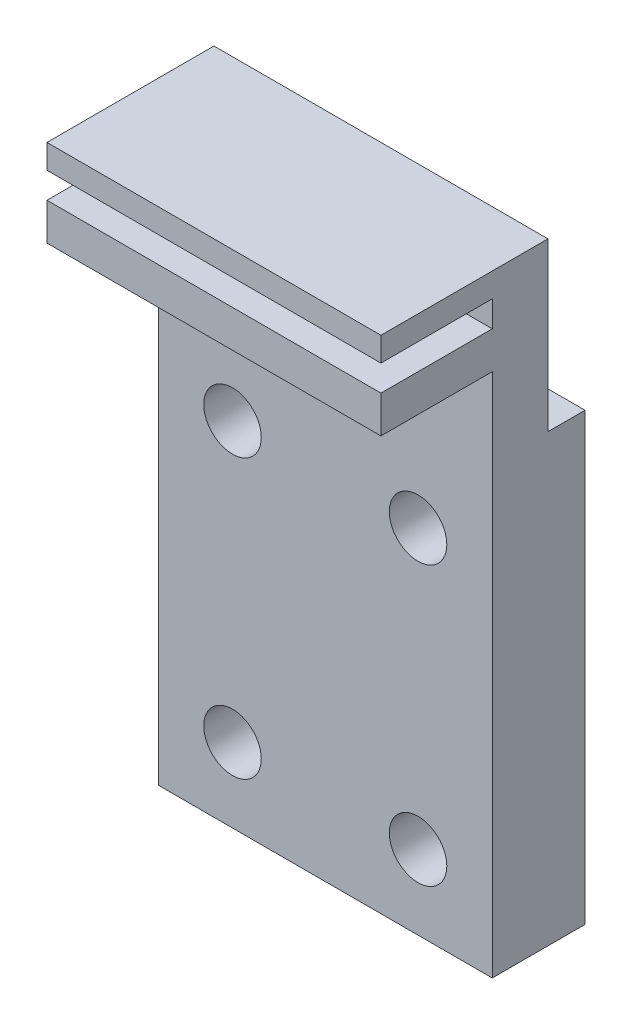
ISO-10303-21;
HEADER;
FILE_DESCRIPTION(('STEP AP214'),'2;1');
FILE_NAME('part.step','',(''),(''),'','','');
FILE_SCHEMA(('AUTOMOTIVE_DESIGN { 1 0 10303 214 1 1 1 1 }'));
ENDSEC;
DATA;
#1=APPLICATION_CONTEXT('core data for automotive mechanical design processes');
#2=APPLICATION_PROTOCOL_DEFINITION('international standard','automotive_design',2000,#1);
#3=PRODUCT_CONTEXT('',#1,'mechanical');
#4=PRODUCT('Part','Part','',(#3));
#5=PRODUCT_RELATED_PRODUCT_CATEGORY('part','',(#4));
#6=PRODUCT_DEFINITION_FORMATION('','',#4);
#7=PRODUCT_DEFINITION_CONTEXT('part definition',#1,'design');
#8=PRODUCT_DEFINITION('design','',#6,#7);
#9=PRODUCT_DEFINITION_SHAPE('','',#8);
#10=(LENGTH_UNIT() NAMED_UNIT(*) SI_UNIT(.MILLI.,.METRE.));
#11=(NAMED_UNIT(*) PLANE_ANGLE_UNIT() SI_UNIT($,.RADIAN.));
#12=(NAMED_UNIT(*) SI_UNIT($,.STERADIAN.) SOLID_ANGLE_UNIT());
#13=UNCERTAINTY_MEASURE_WITH_UNIT(LENGTH_MEASURE(1.E-05),#10,'distance_accuracy_value','');
#14=(GEOMETRIC_REPRESENTATION_CONTEXT(3) GLOBAL_UNCERTAINTY_ASSIGNED_CONTEXT((#13)) GLOBAL_UNIT_ASSIGNED_CONTEXT((#10,
#11,#12)) REPRESENTATION_CONTEXT('',''));
#15=CARTESIAN_POINT('',(0.,0.,0.));
#16=DIRECTION('',(0.,0.,1.));
#17=DIRECTION('',(1.,0.,0.));
#18=AXIS2_PLACEMENT_3D('',#15,#16,#17);
#19=CARTESIAN_POINT('',(0.,0.,0.));
#20=DIRECTION('',(0.,0.,1.));
#21=DIRECTION('',(1.,0.,0.));
#22=AXIS2_PLACEMENT_3D('',#19,#20,#21);
#23=PLANE('',#22);
#24=CARTESIAN_POINT('',(-5.,-7.5,0.));
#25=DIRECTION('',(0.,0.,1.));
#26=DIRECTION('',(1.,0.,0.));
#27=AXIS2_PLACEMENT_3D('',#24,#25,#26);
#28=CIRCLE('',#27,1.55);
#29=CARTESIAN_POINT('',(-3.45,-7.5,0.));
#30=VERTEX_POINT('',#29);
#31=EDGE_CURVE('E203',#30,#30,#28,.T.);
#32=ORIENTED_EDGE('',*,*,#31,.F.);
#33=EDGE_LOOP('',(#32));
#34=FACE_BOUND('',#33,.T.);
#35=CARTESIAN_POINT('',(5.,-7.5,0.));
#36=DIRECTION('',(0.,0.,1.));
#37=DIRECTION('',(1.,0.,0.));
#38=AXIS2_PLACEMENT_3D('',#35,#36,#37);
#39=CIRCLE('',#38,1.55);
#40=CARTESIAN_POINT('',(6.55,-7.5,0.));
#41=VERTEX_POINT('',#40);
#42=EDGE_CURVE('E206',#41,#41,#39,.T.);
#43=ORIENTED_EDGE('',*,*,#42,.F.);
#44=EDGE_LOOP('',(#43));
#45=FACE_BOUND('',#44,.T.);
#46=CARTESIAN_POINT('',(5.,7.5,0.));
#47=DIRECTION('',(0.,0.,1.));
#48=DIRECTION('',(1.,0.,0.));
#49=AXIS2_PLACEMENT_3D('',#46,#47,#48);
#50=CIRCLE('',#49,1.55);
#51=CARTESIAN_POINT('',(6.55,7.5,0.));
#52=VERTEX_POINT('',#51);
#53=EDGE_CURVE('E209',#52,#52,#50,.T.);
#54=ORIENTED_EDGE('',*,*,#53,.F.);
#55=EDGE_LOOP('',(#54));
#56=FACE_BOUND('',#55,.T.);
#57=CARTESIAN_POINT('',(-5.,7.5,0.));
#58=DIRECTION('',(0.,0.,1.));
#59=DIRECTION('',(1.,0.,0.));
#60=AXIS2_PLACEMENT_3D('',#57,#58,#59);
#61=CIRCLE('',#60,1.55);
#62=CARTESIAN_POINT('',(-3.45,7.5,0.));
#63=VERTEX_POINT('',#62);
#64=EDGE_CURVE('E176',#63,#63,#61,.T.);
#65=ORIENTED_EDGE('',*,*,#64,.F.);
#66=EDGE_LOOP('',(#65));
#67=FACE_BOUND('',#66,.T.);
#68=DIRECTION('',(0.,1.,0.));
#69=VECTOR('',#68,1.);
#70=CARTESIAN_POINT('',(9.,0.,0.));
#71=LINE('',#70,#69);
#72=CARTESIAN_POINT('',(9.,-11.5,0.));
#73=VERTEX_POINT('',#72);
#74=CARTESIAN_POINT('',(9.,16.8,0.));
#75=VERTEX_POINT('',#74);
#76=EDGE_CURVE('E201',#73,#75,#71,.T.);
#77=ORIENTED_EDGE('',*,*,#76,.T.);
#78=DIRECTION('',(1.,0.,0.));
#79=VECTOR('',#78,1.);
#80=CARTESIAN_POINT('',(0.,16.8,0.));
#81=LINE('',#80,#79);
#82=CARTESIAN_POINT('',(-9.,16.8,0.));
#83=VERTEX_POINT('',#82);
#84=EDGE_CURVE('E224',#83,#75,#81,.T.);
#85=ORIENTED_EDGE('',*,*,#84,.F.);
#86=DIRECTION('',(0.,1.,0.));
#87=VECTOR('',#86,1.);
#88=CARTESIAN_POINT('',(-9.,0.,0.));
#89=LINE('',#88,#87);
#90=CARTESIAN_POINT('',(-9.,-11.5,0.));
#91=VERTEX_POINT('',#90);
#92=EDGE_CURVE('E194',#91,#83,#89,.T.);
#93=ORIENTED_EDGE('',*,*,#92,.F.);
#94=DIRECTION('',(1.,0.,0.));
#95=VECTOR('',#94,1.);
#96=CARTESIAN_POINT('',(0.,-11.5,0.));
#97=LINE('',#96,#95);
#98=EDGE_CURVE('E197',#91,#73,#97,.T.);
#99=ORIENTED_EDGE('',*,*,#98,.T.);
#100=EDGE_LOOP('',(#77,#85,#93,#99));
#101=FACE_BOUND('',#100,.T.);
#102=ADVANCED_FACE('F37',(#34,#45,#56,#67,#101),#23,.T.);
#103=CARTESIAN_POINT('',(-9.,0.,-5.));
#104=DIRECTION('',(1.,0.,0.));
#105=DIRECTION('',(0.,1.,0.));
#106=AXIS2_PLACEMENT_3D('',#103,#104,#105);
#107=PLANE('',#106);
#108=DIRECTION('',(0.,-1.,0.));
#109=VECTOR('',#108,1.);
#110=CARTESIAN_POINT('',(-9.,21.5,-3.));
#111=LINE('',#110,#109);
#112=CARTESIAN_POINT('',(-9.,21.5,-3.));
#113=VERTEX_POINT('',#112);
#114=CARTESIAN_POINT('',(-9.00000000000001,12.5,-3.));
#115=VERTEX_POINT('',#114);
#116=EDGE_CURVE('E126',#113,#115,#111,.T.);
#117=ORIENTED_EDGE('',*,*,#116,.T.);
#118=DIRECTION('',(0.,0.,-1.));
#119=VECTOR('',#118,1.);
#120=CARTESIAN_POINT('',(-9.00000000000001,12.5,-5.));
#121=LINE('',#120,#119);
#122=CARTESIAN_POINT('',(-9.00000000000001,12.5,-5.));
#123=VERTEX_POINT('',#122);
#124=EDGE_CURVE('E137',#115,#123,#121,.T.);
#125=ORIENTED_EDGE('',*,*,#124,.T.);
#126=DIRECTION('',(0.,1.,0.));
#127=VECTOR('',#126,1.);
#128=CARTESIAN_POINT('',(-9.,0.,-5.));
#129=LINE('',#128,#127);
#130=CARTESIAN_POINT('',(-9.,-11.5,-5.));
#131=VERTEX_POINT('',#130);
#132=EDGE_CURVE('E172',#131,#123,#129,.T.);
#133=ORIENTED_EDGE('',*,*,#132,.F.);
#134=DIRECTION('',(0.,0.,1.));
#135=VECTOR('',#134,1.);
#136=CARTESIAN_POINT('',(-9.,-11.5,-5.));
#137=LINE('',#136,#135);
#138=EDGE_CURVE('E41',#131,#91,#137,.T.);
#139=ORIENTED_EDGE('',*,*,#138,.T.);
#140=ORIENTED_EDGE('',*,*,#92,.T.);
#141=DIRECTION('',(0.,0.,-1.));
#142=VECTOR('',#141,1.);
#143=CARTESIAN_POINT('',(-9.,16.8,6.));
#144=LINE('',#143,#142);
#145=CARTESIAN_POINT('',(-9.,16.8,6.));
#146=VERTEX_POINT('',#145);
#147=EDGE_CURVE('E168',#146,#83,#144,.T.);
#148=ORIENTED_EDGE('',*,*,#147,.F.);
#149=DIRECTION('',(0.,1.,0.));
#150=VECTOR('',#149,1.);
#151=CARTESIAN_POINT('',(-9.,0.,6.));
#152=LINE('',#151,#150);
#153=CARTESIAN_POINT('',(-9.,18.8,6.));
#154=VERTEX_POINT('',#153);
#155=EDGE_CURVE('E454',#146,#154,#152,.T.);
#156=ORIENTED_EDGE('',*,*,#155,.T.);
#157=DIRECTION('',(0.,0.,-1.));
#158=VECTOR('',#157,1.);
#159=CARTESIAN_POINT('',(-9.,18.8,6.));
#160=LINE('',#159,#158);
#161=CARTESIAN_POINT('',(-9.,18.8,0.));
#162=VERTEX_POINT('',#161);
#163=EDGE_CURVE('E464',#154,#162,#160,.T.);
#164=ORIENTED_EDGE('',*,*,#163,.T.);
#165=CARTESIAN_POINT('',(-9.,20.2,0.));
#166=VERTEX_POINT('',#165);
#167=EDGE_CURVE('E171',#162,#166,#89,.T.);
#168=ORIENTED_EDGE('',*,*,#167,.T.);
#169=DIRECTION('',(0.,0.,-1.));
#170=VECTOR('',#169,1.);
#171=CARTESIAN_POINT('',(-9.,20.2,6.));
#172=LINE('',#171,#170);
#173=CARTESIAN_POINT('',(-9.,20.2,6.));
#174=VERTEX_POINT('',#173);
#175=EDGE_CURVE('E149',#174,#166,#172,.T.);
#176=ORIENTED_EDGE('',*,*,#175,.F.);
#177=DIRECTION('',(0.,1.,0.));
#178=VECTOR('',#177,1.);
#179=CARTESIAN_POINT('',(-9.,0.,6.));
#180=LINE('',#179,#178);
#181=CARTESIAN_POINT('',(-9.,21.5,6.));
#182=VERTEX_POINT('',#181);
#183=EDGE_CURVE('E146',#174,#182,#180,.T.);
#184=ORIENTED_EDGE('',*,*,#183,.T.);
#185=DIRECTION('',(0.,0.,1.));
#186=VECTOR('',#185,1.);
#187=CARTESIAN_POINT('',(-9.,21.5,-5.));
#188=LINE('',#187,#186);
#189=EDGE_CURVE('E11',#113,#182,#188,.T.);
#190=ORIENTED_EDGE('',*,*,#189,.F.);
#191=EDGE_LOOP('',(#117,#125,#133,#139,#140,#148,#156,#164,#168,#176,#184,#190));
#192=FACE_BOUND('',#191,.T.);
#193=ADVANCED_FACE('F39',(#192),#107,.F.);
#194=CARTESIAN_POINT('',(0.,21.5,-5.));
#195=DIRECTION('',(0.,-1.,0.));
#196=DIRECTION('',(0.,0.,-1.));
#197=AXIS2_PLACEMENT_3D('',#194,#195,#196);
#198=PLANE('',#197);
#199=DIRECTION('',(0.,0.,1.));
#200=VECTOR('',#199,1.);
#201=CARTESIAN_POINT('',(9.,21.5,-5.));
#202=LINE('',#201,#200);
#203=CARTESIAN_POINT('',(9.,21.5,-3.));
#204=VERTEX_POINT('',#203);
#205=CARTESIAN_POINT('',(9.,21.5,6.));
#206=VERTEX_POINT('',#205);
#207=EDGE_CURVE('E46',#204,#206,#202,.T.);
#208=ORIENTED_EDGE('',*,*,#207,.F.);
#209=DIRECTION('',(1.,0.,0.));
#210=VECTOR('',#209,1.);
#211=CARTESIAN_POINT('',(-9.,21.5,-3.));
#212=LINE('',#211,#210);
#213=EDGE_CURVE('E130',#113,#204,#212,.T.);
#214=ORIENTED_EDGE('',*,*,#213,.F.);
#215=ORIENTED_EDGE('',*,*,#189,.T.);
#216=DIRECTION('',(1.,0.,0.));
#217=VECTOR('',#216,1.);
#218=CARTESIAN_POINT('',(0.,21.5,6.));
#219=LINE('',#218,#217);
#220=EDGE_CURVE('E156',#182,#206,#219,.T.);
#221=ORIENTED_EDGE('',*,*,#220,.T.);
#222=EDGE_LOOP('',(#208,#214,#215,#221));
#223=FACE_BOUND('',#222,.T.);
#224=ADVANCED_FACE('F141',(#223),#198,.F.);
#225=CARTESIAN_POINT('',(9.,0.,-5.));
#226=DIRECTION('',(1.,0.,0.));
#227=DIRECTION('',(0.,1.,0.));
#228=AXIS2_PLACEMENT_3D('',#225,#226,#227);
#229=PLANE('',#228);
#230=DIRECTION('',(0.,0.,-1.));
#231=VECTOR('',#230,1.);
#232=CARTESIAN_POINT('',(9.,12.5,-5.));
#233=LINE('',#232,#231);
#234=CARTESIAN_POINT('',(9.,12.5,-3.));
#235=VERTEX_POINT('',#234);
#236=CARTESIAN_POINT('',(9.,12.5,-5.));
#237=VERTEX_POINT('',#236);
#238=EDGE_CURVE('E54',#235,#237,#233,.T.);
#239=ORIENTED_EDGE('',*,*,#238,.F.);
#240=DIRECTION('',(0.,-1.,0.));
#241=VECTOR('',#240,1.);
#242=CARTESIAN_POINT('',(9.,21.5,-3.));
#243=LINE('',#242,#241);
#244=EDGE_CURVE('E445',#204,#235,#243,.T.);
#245=ORIENTED_EDGE('',*,*,#244,.F.);
#246=ORIENTED_EDGE('',*,*,#207,.T.);
#247=DIRECTION('',(0.,1.,0.));
#248=VECTOR('',#247,1.);
#249=CARTESIAN_POINT('',(9.,0.,6.));
#250=LINE('',#249,#248);
#251=CARTESIAN_POINT('',(9.,20.2,6.));
#252=VERTEX_POINT('',#251);
#253=EDGE_CURVE('E159',#252,#206,#250,.T.);
#254=ORIENTED_EDGE('',*,*,#253,.F.);
#255=DIRECTION('',(0.,0.,-1.));
#256=VECTOR('',#255,1.);
#257=CARTESIAN_POINT('',(9.,20.2,6.));
#258=LINE('',#257,#256);
#259=CARTESIAN_POINT('',(9.,20.2,0.));
#260=VERTEX_POINT('',#259);
#261=EDGE_CURVE('E160',#252,#260,#258,.T.);
#262=ORIENTED_EDGE('',*,*,#261,.T.);
#263=CARTESIAN_POINT('',(9.,18.8,0.));
#264=VERTEX_POINT('',#263);
#265=EDGE_CURVE('E200',#264,#260,#71,.T.);
#266=ORIENTED_EDGE('',*,*,#265,.F.);
#267=DIRECTION('',(0.,0.,-1.));
#268=VECTOR('',#267,1.);
#269=CARTESIAN_POINT('',(9.,18.8,6.));
#270=LINE('',#269,#268);
#271=CARTESIAN_POINT('',(9.,18.8,6.));
#272=VERTEX_POINT('',#271);
#273=EDGE_CURVE('E469',#272,#264,#270,.T.);
#274=ORIENTED_EDGE('',*,*,#273,.F.);
#275=DIRECTION('',(0.,1.,0.));
#276=VECTOR('',#275,1.);
#277=CARTESIAN_POINT('',(9.,0.,6.));
#278=LINE('',#277,#276);
#279=CARTESIAN_POINT('',(9.,16.8,6.));
#280=VERTEX_POINT('',#279);
#281=EDGE_CURVE('E459',#280,#272,#278,.T.);
#282=ORIENTED_EDGE('',*,*,#281,.F.);
#283=DIRECTION('',(0.,0.,-1.));
#284=VECTOR('',#283,1.);
#285=CARTESIAN_POINT('',(9.,16.8,6.));
#286=LINE('',#285,#284);
#287=EDGE_CURVE('E472',#280,#75,#286,.T.);
#288=ORIENTED_EDGE('',*,*,#287,.T.);
#289=ORIENTED_EDGE('',*,*,#76,.F.);
#290=DIRECTION('',(0.,0.,1.));
#291=VECTOR('',#290,1.);
#292=CARTESIAN_POINT('',(9.,-11.5,-5.));
#293=LINE('',#292,#291);
#294=CARTESIAN_POINT('',(9.,-11.5,-5.));
#295=VERTEX_POINT('',#294);
#296=EDGE_CURVE('E214',#295,#73,#293,.T.);
#297=ORIENTED_EDGE('',*,*,#296,.F.);
#298=DIRECTION('',(0.,1.,0.));
#299=VECTOR('',#298,1.);
#300=CARTESIAN_POINT('',(9.,0.,-5.));
#301=LINE('',#300,#299);
#302=EDGE_CURVE('E179',#295,#237,#301,.T.);
#303=ORIENTED_EDGE('',*,*,#302,.T.);
#304=EDGE_LOOP('',(#239,#245,#246,#254,#262,#266,#274,#282,#288,#289,#297,#303));
#305=FACE_BOUND('',#304,.T.);
#306=ADVANCED_FACE('F322',(#305),#229,.T.);
#307=CARTESIAN_POINT('',(5.,7.5,-5.));
#308=DIRECTION('',(0.,0.,1.));
#309=DIRECTION('',(1.,0.,0.));
#310=AXIS2_PLACEMENT_3D('',#307,#308,#309);
#311=CYLINDRICAL_SURFACE('',#310,1.55);
#312=CARTESIAN_POINT('',(5.,7.5,-5.));
#313=DIRECTION('',(0.,0.,1.));
#314=DIRECTION('',(1.,0.,0.));
#315=AXIS2_PLACEMENT_3D('',#312,#313,#314);
#316=CIRCLE('',#315,1.55);
#317=CARTESIAN_POINT('',(6.55,7.5,-5.));
#318=VERTEX_POINT('',#317);
#319=EDGE_CURVE('E188',#318,#318,#316,.T.);
#320=ORIENTED_EDGE('',*,*,#319,.F.);
#321=EDGE_LOOP('',(#320));
#322=FACE_BOUND('',#321,.T.);
#323=ORIENTED_EDGE('',*,*,#53,.T.);
#324=EDGE_LOOP('',(#323));
#325=FACE_BOUND('',#324,.T.);
#326=ADVANCED_FACE('F327',(#322,#325),#311,.F.);
#327=CARTESIAN_POINT('',(5.,-7.5,-5.));
#328=DIRECTION('',(0.,0.,1.));
#329=DIRECTION('',(1.,0.,0.));
#330=AXIS2_PLACEMENT_3D('',#327,#328,#329);
#331=CYLINDRICAL_SURFACE('',#330,1.55);
#332=CARTESIAN_POINT('',(5.,-7.5,-5.));
#333=DIRECTION('',(0.,0.,1.));
#334=DIRECTION('',(1.,0.,0.));
#335=AXIS2_PLACEMENT_3D('',#332,#333,#334);
#336=CIRCLE('',#335,1.55);
#337=CARTESIAN_POINT('',(6.55,-7.5,-5.));
#338=VERTEX_POINT('',#337);
#339=EDGE_CURVE('E185',#338,#338,#336,.T.);
#340=ORIENTED_EDGE('',*,*,#339,.F.);
#341=EDGE_LOOP('',(#340));
#342=FACE_BOUND('',#341,.T.);
#343=ORIENTED_EDGE('',*,*,#42,.T.);
#344=EDGE_LOOP('',(#343));
#345=FACE_BOUND('',#344,.T.);
#346=ADVANCED_FACE('F236',(#342,#345),#331,.F.);
#347=CARTESIAN_POINT('',(-5.,-7.5,-5.));
#348=DIRECTION('',(0.,0.,1.));
#349=DIRECTION('',(1.,0.,0.));
#350=AXIS2_PLACEMENT_3D('',#347,#348,#349);
#351=CYLINDRICAL_SURFACE('',#350,1.55);
#352=CARTESIAN_POINT('',(-5.,-7.5,-5.));
#353=DIRECTION('',(0.,0.,1.));
#354=DIRECTION('',(1.,0.,0.));
#355=AXIS2_PLACEMENT_3D('',#352,#353,#354);
#356=CIRCLE('',#355,1.55);
#357=CARTESIAN_POINT('',(-3.45,-7.5,-5.));
#358=VERTEX_POINT('',#357);
#359=EDGE_CURVE('E182',#358,#358,#356,.T.);
#360=ORIENTED_EDGE('',*,*,#359,.F.);
#361=EDGE_LOOP('',(#360));
#362=FACE_BOUND('',#361,.T.);
#363=ORIENTED_EDGE('',*,*,#31,.T.);
#364=EDGE_LOOP('',(#363));
#365=FACE_BOUND('',#364,.T.);
#366=ADVANCED_FACE('F228',(#362,#365),#351,.F.);
#367=CARTESIAN_POINT('',(0.,-11.5,-5.));
#368=DIRECTION('',(0.,-1.,0.));
#369=DIRECTION('',(0.,0.,-1.));
#370=AXIS2_PLACEMENT_3D('',#367,#368,#369);
#371=PLANE('',#370);
#372=ORIENTED_EDGE('',*,*,#98,.F.);
#373=ORIENTED_EDGE('',*,*,#138,.F.);
#374=DIRECTION('',(1.,0.,0.));
#375=VECTOR('',#374,1.);
#376=CARTESIAN_POINT('',(0.,-11.5,-5.));
#377=LINE('',#376,#375);
#378=EDGE_CURVE('E175',#131,#295,#377,.T.);
#379=ORIENTED_EDGE('',*,*,#378,.T.);
#380=ORIENTED_EDGE('',*,*,#296,.T.);
#381=EDGE_LOOP('',(#372,#373,#379,#380));
#382=FACE_BOUND('',#381,.T.);
#383=ADVANCED_FACE('F225',(#382),#371,.T.);
#384=CARTESIAN_POINT('',(-5.,7.5,-5.));
#385=DIRECTION('',(0.,0.,1.));
#386=DIRECTION('',(1.,0.,0.));
#387=AXIS2_PLACEMENT_3D('',#384,#385,#386);
#388=CYLINDRICAL_SURFACE('',#387,1.55);
#389=CARTESIAN_POINT('',(-5.,7.5,-5.));
#390=DIRECTION('',(0.,0.,1.));
#391=DIRECTION('',(1.,0.,0.));
#392=AXIS2_PLACEMENT_3D('',#389,#390,#391);
#393=CIRCLE('',#392,1.55);
#394=CARTESIAN_POINT('',(-3.45,7.5,-5.));
#395=VERTEX_POINT('',#394);
#396=EDGE_CURVE('E191',#395,#395,#393,.T.);
#397=ORIENTED_EDGE('',*,*,#396,.F.);
#398=EDGE_LOOP('',(#397));
#399=FACE_BOUND('',#398,.T.);
#400=ORIENTED_EDGE('',*,*,#64,.T.);
#401=EDGE_LOOP('',(#400));
#402=FACE_BOUND('',#401,.T.);
#403=ADVANCED_FACE('F227',(#399,#402),#388,.F.);
#404=CARTESIAN_POINT('',(0.,0.,-5.));
#405=DIRECTION('',(0.,0.,1.));
#406=DIRECTION('',(1.,0.,0.));
#407=AXIS2_PLACEMENT_3D('',#404,#405,#406);
#408=PLANE('',#407);
#409=ORIENTED_EDGE('',*,*,#132,.T.);
#410=DIRECTION('',(1.,0.,0.));
#411=VECTOR('',#410,1.);
#412=CARTESIAN_POINT('',(-9.00000000000001,12.5,-5.));
#413=LINE('',#412,#411);
#414=EDGE_CURVE('E451',#123,#237,#413,.T.);
#415=ORIENTED_EDGE('',*,*,#414,.T.);
#416=ORIENTED_EDGE('',*,*,#302,.F.);
#417=ORIENTED_EDGE('',*,*,#378,.F.);
#418=EDGE_LOOP('',(#409,#415,#416,#417));
#419=FACE_BOUND('',#418,.T.);
#420=ORIENTED_EDGE('',*,*,#359,.T.);
#421=EDGE_LOOP('',(#420));
#422=FACE_BOUND('',#421,.T.);
#423=ORIENTED_EDGE('',*,*,#339,.T.);
#424=EDGE_LOOP('',(#423));
#425=FACE_BOUND('',#424,.T.);
#426=ORIENTED_EDGE('',*,*,#319,.T.);
#427=EDGE_LOOP('',(#426));
#428=FACE_BOUND('',#427,.T.);
#429=ORIENTED_EDGE('',*,*,#396,.T.);
#430=EDGE_LOOP('',(#429));
#431=FACE_BOUND('',#430,.T.);
#432=ADVANCED_FACE('F233',(#419,#422,#425,#428,#431),#408,.F.);
#433=DIRECTION('',(1.,0.,0.));
#434=VECTOR('',#433,1.);
#435=CARTESIAN_POINT('',(0.,18.8,0.));
#436=LINE('',#435,#434);
#437=EDGE_CURVE('E62',#162,#264,#436,.T.);
#438=ORIENTED_EDGE('',*,*,#437,.T.);
#439=ORIENTED_EDGE('',*,*,#265,.T.);
#440=DIRECTION('',(1.,0.,0.));
#441=VECTOR('',#440,1.);
#442=CARTESIAN_POINT('',(0.,20.2,0.));
#443=LINE('',#442,#441);
#444=EDGE_CURVE('E153',#166,#260,#443,.T.);
#445=ORIENTED_EDGE('',*,*,#444,.F.);
#446=ORIENTED_EDGE('',*,*,#167,.F.);
#447=EDGE_LOOP('',(#438,#439,#445,#446));
#448=FACE_BOUND('',#447,.T.);
#449=ADVANCED_FACE('F243',(#448),#23,.T.);
#450=CARTESIAN_POINT('',(0.,20.2,6.));
#451=DIRECTION('',(0.,1.,0.));
#452=DIRECTION('',(0.,0.,1.));
#453=AXIS2_PLACEMENT_3D('',#450,#451,#452);
#454=PLANE('',#453);
#455=ORIENTED_EDGE('',*,*,#444,.T.);
#456=ORIENTED_EDGE('',*,*,#261,.F.);
#457=DIRECTION('',(1.,0.,0.));
#458=VECTOR('',#457,1.);
#459=CARTESIAN_POINT('',(0.,20.2,6.));
#460=LINE('',#459,#458);
#461=EDGE_CURVE('E152',#174,#252,#460,.T.);
#462=ORIENTED_EDGE('',*,*,#461,.F.);
#463=ORIENTED_EDGE('',*,*,#175,.T.);
#464=EDGE_LOOP('',(#455,#456,#462,#463));
#465=FACE_BOUND('',#464,.T.);
#466=ADVANCED_FACE('F252',(#465),#454,.F.);
#467=CARTESIAN_POINT('',(0.,0.,6.));
#468=DIRECTION('',(0.,0.,1.));
#469=DIRECTION('',(1.,0.,0.));
#470=AXIS2_PLACEMENT_3D('',#467,#468,#469);
#471=PLANE('',#470);
#472=ORIENTED_EDGE('',*,*,#183,.F.);
#473=ORIENTED_EDGE('',*,*,#461,.T.);
#474=ORIENTED_EDGE('',*,*,#253,.T.);
#475=ORIENTED_EDGE('',*,*,#220,.F.);
#476=EDGE_LOOP('',(#472,#473,#474,#475));
#477=FACE_BOUND('',#476,.T.);
#478=ADVANCED_FACE('F157',(#477),#471,.T.);
#479=CARTESIAN_POINT('',(0.,16.8,6.));
#480=DIRECTION('',(0.,1.,0.));
#481=DIRECTION('',(0.,0.,1.));
#482=AXIS2_PLACEMENT_3D('',#479,#480,#481);
#483=PLANE('',#482);
#484=ORIENTED_EDGE('',*,*,#84,.T.);
#485=ORIENTED_EDGE('',*,*,#287,.F.);
#486=DIRECTION('',(1.,0.,0.));
#487=VECTOR('',#486,1.);
#488=CARTESIAN_POINT('',(0.,16.8,6.));
#489=LINE('',#488,#487);
#490=EDGE_CURVE('E457',#146,#280,#489,.T.);
#491=ORIENTED_EDGE('',*,*,#490,.F.);
#492=ORIENTED_EDGE('',*,*,#147,.T.);
#493=EDGE_LOOP('',(#484,#485,#491,#492));
#494=FACE_BOUND('',#493,.T.);
#495=ADVANCED_FACE('F268',(#494),#483,.F.);
#496=CARTESIAN_POINT('',(0.,18.8,6.));
#497=DIRECTION('',(0.,1.,0.));
#498=DIRECTION('',(0.,0.,1.));
#499=AXIS2_PLACEMENT_3D('',#496,#497,#498);
#500=PLANE('',#499);
#501=ORIENTED_EDGE('',*,*,#437,.F.);
#502=ORIENTED_EDGE('',*,*,#163,.F.);
#503=DIRECTION('',(1.,0.,0.));
#504=VECTOR('',#503,1.);
#505=CARTESIAN_POINT('',(0.,18.8,6.));
#506=LINE('',#505,#504);
#507=EDGE_CURVE('E461',#154,#272,#506,.T.);
#508=ORIENTED_EDGE('',*,*,#507,.T.);
#509=ORIENTED_EDGE('',*,*,#273,.T.);
#510=EDGE_LOOP('',(#501,#502,#508,#509));
#511=FACE_BOUND('',#510,.T.);
#512=ADVANCED_FACE('F271',(#511),#500,.T.);
#513=CARTESIAN_POINT('',(0.,0.,6.));
#514=DIRECTION('',(0.,0.,1.));
#515=DIRECTION('',(1.,0.,0.));
#516=AXIS2_PLACEMENT_3D('',#513,#514,#515);
#517=PLANE('',#516);
#518=ORIENTED_EDGE('',*,*,#155,.F.);
#519=ORIENTED_EDGE('',*,*,#490,.T.);
#520=ORIENTED_EDGE('',*,*,#281,.T.);
#521=ORIENTED_EDGE('',*,*,#507,.F.);
#522=EDGE_LOOP('',(#518,#519,#520,#521));
#523=FACE_BOUND('',#522,.T.);
#524=ADVANCED_FACE('F275',(#523),#517,.T.);
#525=CARTESIAN_POINT('',(-9.00000000000001,12.5,-5.));
#526=DIRECTION('',(0.,-1.,0.));
#527=DIRECTION('',(1.,0.,0.));
#528=AXIS2_PLACEMENT_3D('',#525,#526,#527);
#529=PLANE('',#528);
#530=ORIENTED_EDGE('',*,*,#238,.T.);
#531=ORIENTED_EDGE('',*,*,#414,.F.);
#532=ORIENTED_EDGE('',*,*,#124,.F.);
#533=DIRECTION('',(1.,0.,0.));
#534=VECTOR('',#533,1.);
#535=CARTESIAN_POINT('',(-9.00000000000001,12.5,-3.));
#536=LINE('',#535,#534);
#537=EDGE_CURVE('E132',#115,#235,#536,.T.);
#538=ORIENTED_EDGE('',*,*,#537,.T.);
#539=EDGE_LOOP('',(#530,#531,#532,#538));
#540=FACE_BOUND('',#539,.T.);
#541=ADVANCED_FACE('F279',(#540),#529,.F.);
#542=CARTESIAN_POINT('',(-9.,21.5,-3.));
#543=DIRECTION('',(0.,0.,1.));
#544=DIRECTION('',(0.,-1.,0.));
#545=AXIS2_PLACEMENT_3D('',#542,#543,#544);
#546=PLANE('',#545);
#547=ORIENTED_EDGE('',*,*,#244,.T.);
#548=ORIENTED_EDGE('',*,*,#537,.F.);
#549=ORIENTED_EDGE('',*,*,#116,.F.);
#550=ORIENTED_EDGE('',*,*,#213,.T.);
#551=EDGE_LOOP('',(#547,#548,#549,#550));
#552=FACE_BOUND('',#551,.T.);
#553=ADVANCED_FACE('F129',(#552),#546,.F.);
#554=CLOSED_SHELL('',(#102,#193,#224,#306,#326,#346,#366,#383,#403,#432,#449,#466,#478,#495,
#512,#524,#541,#553));
#555=MANIFOLD_SOLID_BREP('B2',#554);
#556=ADVANCED_BREP_SHAPE_REPRESENTATION('',(#18,#555),#14);
#557=SHAPE_DEFINITION_REPRESENTATION(#9,#556);
ENDSEC;
END-ISO-10303-21;
